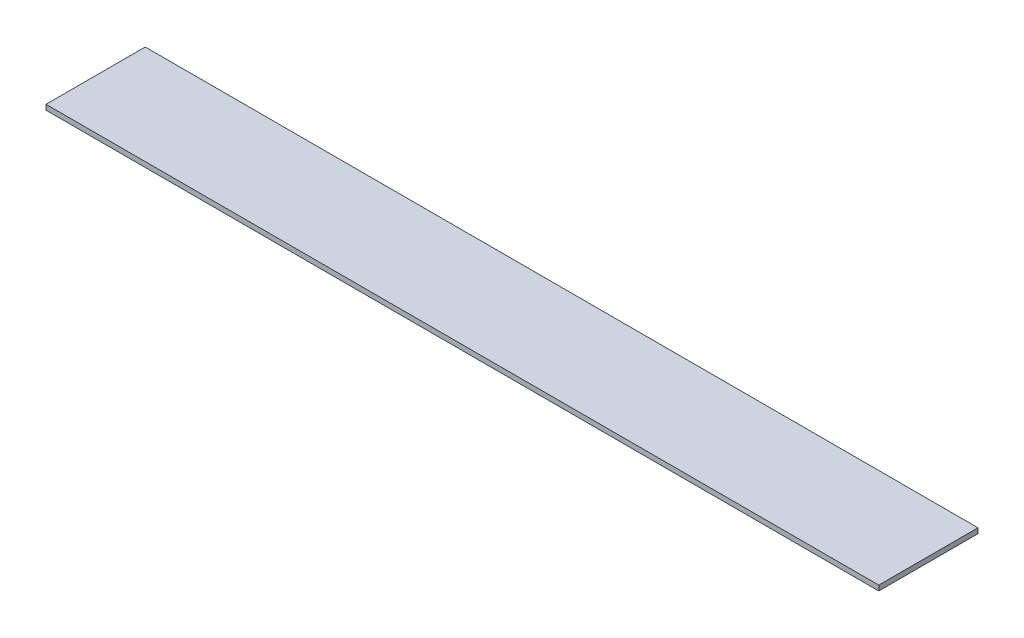
ISO-10303-21;
HEADER;
FILE_DESCRIPTION(('STEP AP214'),'2;1');
FILE_NAME('part.step','',(''),(''),'','','');
FILE_SCHEMA(('AUTOMOTIVE_DESIGN { 1 0 10303 214 1 1 1 1 }'));
ENDSEC;
DATA;
#1=APPLICATION_CONTEXT('core data for automotive mechanical design processes');
#2=APPLICATION_PROTOCOL_DEFINITION('international standard','automotive_design',2000,#1);
#3=PRODUCT_CONTEXT('',#1,'mechanical');
#4=PRODUCT('Part','Part','',(#3));
#5=PRODUCT_RELATED_PRODUCT_CATEGORY('part','',(#4));
#6=PRODUCT_DEFINITION_FORMATION('','',#4);
#7=PRODUCT_DEFINITION_CONTEXT('part definition',#1,'design');
#8=PRODUCT_DEFINITION('design','',#6,#7);
#9=PRODUCT_DEFINITION_SHAPE('','',#8);
#10=(LENGTH_UNIT() NAMED_UNIT(*) SI_UNIT(.MILLI.,.METRE.));
#11=(NAMED_UNIT(*) PLANE_ANGLE_UNIT() SI_UNIT($,.RADIAN.));
#12=(NAMED_UNIT(*) SI_UNIT($,.STERADIAN.) SOLID_ANGLE_UNIT());
#13=UNCERTAINTY_MEASURE_WITH_UNIT(LENGTH_MEASURE(1.E-05),#10,'distance_accuracy_value','');
#14=(GEOMETRIC_REPRESENTATION_CONTEXT(3) GLOBAL_UNCERTAINTY_ASSIGNED_CONTEXT((#13)) GLOBAL_UNIT_ASSIGNED_CONTEXT((#10,
#11,#12)) REPRESENTATION_CONTEXT('',''));
#15=CARTESIAN_POINT('',(0.,0.,0.));
#16=DIRECTION('',(0.,0.,1.));
#17=DIRECTION('',(1.,0.,0.));
#18=AXIS2_PLACEMENT_3D('',#15,#16,#17);
#19=CARTESIAN_POINT('',(0.,31.,-600.));
#20=DIRECTION('',(0.,0.,-1.));
#21=DIRECTION('',(-1.,0.,0.));
#22=AXIS2_PLACEMENT_3D('',#19,#20,#21);
#23=PLANE('',#22);
#24=DIRECTION('',(1.,0.,0.));
#25=VECTOR('',#24,1.);
#26=CARTESIAN_POINT('',(0.,0.,-600.));
#27=LINE('',#26,#25);
#28=CARTESIAN_POINT('',(0.,0.,-600.));
#29=VERTEX_POINT('',#28);
#30=CARTESIAN_POINT('',(5035.,0.,-600.));
#31=VERTEX_POINT('',#30);
#32=EDGE_CURVE('E101',#29,#31,#27,.T.);
#33=ORIENTED_EDGE('',*,*,#32,.F.);
#34=DIRECTION('',(0.,-1.,0.));
#35=VECTOR('',#34,1.);
#36=CARTESIAN_POINT('',(0.,31.,-600.));
#37=LINE('',#36,#35);
#38=CARTESIAN_POINT('',(0.,31.,-600.));
#39=VERTEX_POINT('',#38);
#40=EDGE_CURVE('E11',#39,#29,#37,.T.);
#41=ORIENTED_EDGE('',*,*,#40,.F.);
#42=DIRECTION('',(1.,0.,0.));
#43=VECTOR('',#42,1.);
#44=CARTESIAN_POINT('',(0.,31.,-600.));
#45=LINE('',#44,#43);
#46=CARTESIAN_POINT('',(5035.,31.,-600.));
#47=VERTEX_POINT('',#46);
#48=EDGE_CURVE('E95',#39,#47,#45,.T.);
#49=ORIENTED_EDGE('',*,*,#48,.T.);
#50=DIRECTION('',(0.,-1.,0.));
#51=VECTOR('',#50,1.);
#52=CARTESIAN_POINT('',(5035.,31.,-600.));
#53=LINE('',#52,#51);
#54=EDGE_CURVE('E40',#47,#31,#53,.T.);
#55=ORIENTED_EDGE('',*,*,#54,.T.);
#56=EDGE_LOOP('',(#33,#41,#49,#55));
#57=FACE_BOUND('',#56,.T.);
#58=ADVANCED_FACE('F37',(#57),#23,.T.);
#59=CARTESIAN_POINT('',(0.,31.,0.));
#60=DIRECTION('',(-1.,0.,0.));
#61=DIRECTION('',(0.,0.,1.));
#62=AXIS2_PLACEMENT_3D('',#59,#60,#61);
#63=PLANE('',#62);
#64=DIRECTION('',(0.,0.,-1.));
#65=VECTOR('',#64,1.);
#66=CARTESIAN_POINT('',(0.,0.,0.));
#67=LINE('',#66,#65);
#68=CARTESIAN_POINT('',(0.,0.,0.));
#69=VERTEX_POINT('',#68);
#70=EDGE_CURVE('E97',#69,#29,#67,.T.);
#71=ORIENTED_EDGE('',*,*,#70,.F.);
#72=DIRECTION('',(0.,-1.,0.));
#73=VECTOR('',#72,1.);
#74=CARTESIAN_POINT('',(0.,31.,0.));
#75=LINE('',#74,#73);
#76=CARTESIAN_POINT('',(0.,31.,0.));
#77=VERTEX_POINT('',#76);
#78=EDGE_CURVE('E46',#77,#69,#75,.T.);
#79=ORIENTED_EDGE('',*,*,#78,.F.);
#80=DIRECTION('',(0.,0.,-1.));
#81=VECTOR('',#80,1.);
#82=CARTESIAN_POINT('',(0.,31.,0.));
#83=LINE('',#82,#81);
#84=EDGE_CURVE('E85',#77,#39,#83,.T.);
#85=ORIENTED_EDGE('',*,*,#84,.T.);
#86=ORIENTED_EDGE('',*,*,#40,.T.);
#87=EDGE_LOOP('',(#71,#79,#85,#86));
#88=FACE_BOUND('',#87,.T.);
#89=ADVANCED_FACE('F111',(#88),#63,.T.);
#90=CARTESIAN_POINT('',(0.,31.,0.));
#91=DIRECTION('',(0.,0.,-1.));
#92=DIRECTION('',(-1.,0.,0.));
#93=AXIS2_PLACEMENT_3D('',#90,#91,#92);
#94=PLANE('',#93);
#95=DIRECTION('',(1.,0.,0.));
#96=VECTOR('',#95,1.);
#97=CARTESIAN_POINT('',(0.,0.,0.));
#98=LINE('',#97,#96);
#99=CARTESIAN_POINT('',(5035.,0.,0.));
#100=VERTEX_POINT('',#99);
#101=EDGE_CURVE('E90',#69,#100,#98,.T.);
#102=ORIENTED_EDGE('',*,*,#101,.T.);
#103=DIRECTION('',(0.,-1.,0.));
#104=VECTOR('',#103,1.);
#105=CARTESIAN_POINT('',(5035.,31.,0.));
#106=LINE('',#105,#104);
#107=CARTESIAN_POINT('',(5035.,31.,0.));
#108=VERTEX_POINT('',#107);
#109=EDGE_CURVE('E88',#108,#100,#106,.T.);
#110=ORIENTED_EDGE('',*,*,#109,.F.);
#111=DIRECTION('',(1.,0.,0.));
#112=VECTOR('',#111,1.);
#113=CARTESIAN_POINT('',(0.,31.,0.));
#114=LINE('',#113,#112);
#115=EDGE_CURVE('E82',#77,#108,#114,.T.);
#116=ORIENTED_EDGE('',*,*,#115,.F.);
#117=ORIENTED_EDGE('',*,*,#78,.T.);
#118=EDGE_LOOP('',(#102,#110,#116,#117));
#119=FACE_BOUND('',#118,.T.);
#120=ADVANCED_FACE('F89',(#119),#94,.F.);
#121=CARTESIAN_POINT('',(5035.,31.,0.));
#122=DIRECTION('',(-1.,0.,0.));
#123=DIRECTION('',(0.,0.,1.));
#124=AXIS2_PLACEMENT_3D('',#121,#122,#123);
#125=PLANE('',#124);
#126=DIRECTION('',(0.,0.,-1.));
#127=VECTOR('',#126,1.);
#128=CARTESIAN_POINT('',(5035.,0.,0.));
#129=LINE('',#128,#127);
#130=EDGE_CURVE('E104',#100,#31,#129,.T.);
#131=ORIENTED_EDGE('',*,*,#130,.T.);
#132=ORIENTED_EDGE('',*,*,#54,.F.);
#133=DIRECTION('',(0.,0.,-1.));
#134=VECTOR('',#133,1.);
#135=CARTESIAN_POINT('',(5035.,31.,0.));
#136=LINE('',#135,#134);
#137=EDGE_CURVE('E79',#108,#47,#136,.T.);
#138=ORIENTED_EDGE('',*,*,#137,.F.);
#139=ORIENTED_EDGE('',*,*,#109,.T.);
#140=EDGE_LOOP('',(#131,#132,#138,#139));
#141=FACE_BOUND('',#140,.T.);
#142=ADVANCED_FACE('F94',(#141),#125,.F.);
#143=CARTESIAN_POINT('',(0.,31.,0.));
#144=DIRECTION('',(0.,1.,0.));
#145=DIRECTION('',(0.,0.,1.));
#146=AXIS2_PLACEMENT_3D('',#143,#144,#145);
#147=PLANE('',#146);
#148=ORIENTED_EDGE('',*,*,#48,.F.);
#149=ORIENTED_EDGE('',*,*,#84,.F.);
#150=ORIENTED_EDGE('',*,*,#115,.T.);
#151=ORIENTED_EDGE('',*,*,#137,.T.);
#152=EDGE_LOOP('',(#148,#149,#150,#151));
#153=FACE_BOUND('',#152,.T.);
#154=ADVANCED_FACE('F84',(#153),#147,.T.);
#155=CARTESIAN_POINT('',(0.,0.,0.));
#156=DIRECTION('',(0.,1.,0.));
#157=DIRECTION('',(0.,0.,1.));
#158=AXIS2_PLACEMENT_3D('',#155,#156,#157);
#159=PLANE('',#158);
#160=ORIENTED_EDGE('',*,*,#32,.T.);
#161=ORIENTED_EDGE('',*,*,#130,.F.);
#162=ORIENTED_EDGE('',*,*,#101,.F.);
#163=ORIENTED_EDGE('',*,*,#70,.T.);
#164=EDGE_LOOP('',(#160,#161,#162,#163));
#165=FACE_BOUND('',#164,.T.);
#166=ADVANCED_FACE('F110',(#165),#159,.F.);
#167=CLOSED_SHELL('',(#58,#89,#120,#142,#154,#166));
#168=MANIFOLD_SOLID_BREP('B2',#167);
#169=ADVANCED_BREP_SHAPE_REPRESENTATION('',(#18,#168),#14);
#170=SHAPE_DEFINITION_REPRESENTATION(#9,#169);
ENDSEC;
END-ISO-10303-21;
